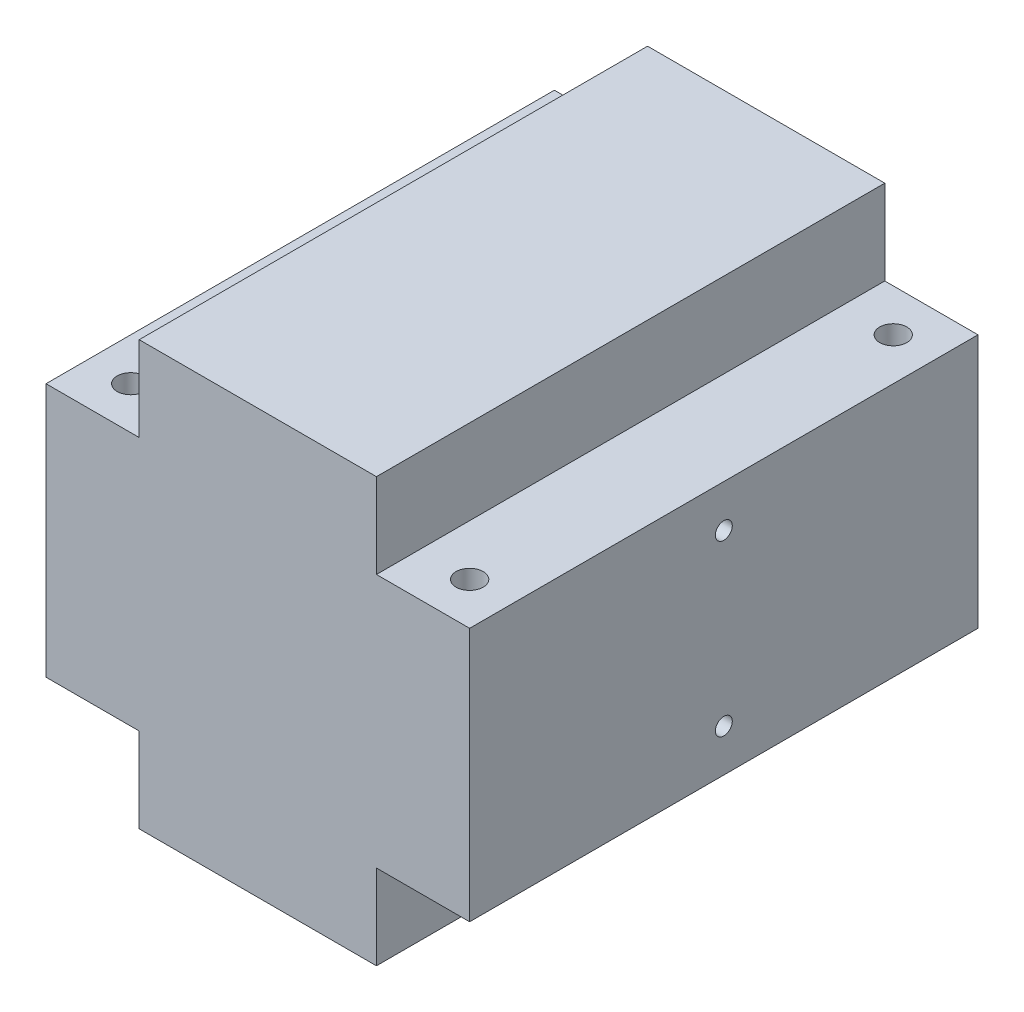
ISO-10303-21;
HEADER;
FILE_DESCRIPTION(('STEP AP214'),'2;1');
FILE_NAME('part.step','',(''),(''),'','','');
FILE_SCHEMA(('AUTOMOTIVE_DESIGN { 1 0 10303 214 1 1 1 1 }'));
ENDSEC;
DATA;
#1=APPLICATION_CONTEXT('core data for automotive mechanical design processes');
#2=APPLICATION_PROTOCOL_DEFINITION('international standard','automotive_design',2000,#1);
#3=PRODUCT_CONTEXT('',#1,'mechanical');
#4=PRODUCT('Part','Part','',(#3));
#5=PRODUCT_RELATED_PRODUCT_CATEGORY('part','',(#4));
#6=PRODUCT_DEFINITION_FORMATION('','',#4);
#7=PRODUCT_DEFINITION_CONTEXT('part definition',#1,'design');
#8=PRODUCT_DEFINITION('design','',#6,#7);
#9=PRODUCT_DEFINITION_SHAPE('','',#8);
#10=(LENGTH_UNIT() NAMED_UNIT(*) SI_UNIT(.MILLI.,.METRE.));
#11=(NAMED_UNIT(*) PLANE_ANGLE_UNIT() SI_UNIT($,.RADIAN.));
#12=(NAMED_UNIT(*) SI_UNIT($,.STERADIAN.) SOLID_ANGLE_UNIT());
#13=UNCERTAINTY_MEASURE_WITH_UNIT(LENGTH_MEASURE(1.E-05),#10,'distance_accuracy_value','');
#14=(GEOMETRIC_REPRESENTATION_CONTEXT(3) GLOBAL_UNCERTAINTY_ASSIGNED_CONTEXT((#13)) GLOBAL_UNIT_ASSIGNED_CONTEXT((#10,
#11,#12)) REPRESENTATION_CONTEXT('',''));
#15=CARTESIAN_POINT('',(0.,0.,0.));
#16=DIRECTION('',(0.,0.,1.));
#17=DIRECTION('',(1.,0.,0.));
#18=AXIS2_PLACEMENT_3D('',#15,#16,#17);
#19=CARTESIAN_POINT('',(0.,400.,600.));
#20=DIRECTION('',(0.,-1.,0.));
#21=DIRECTION('',(0.,0.,-1.));
#22=AXIS2_PLACEMENT_3D('',#19,#20,#21);
#23=PLANE('',#22);
#24=CARTESIAN_POINT('',(50.,400.,50.));
#25=DIRECTION('',(0.,-1.,0.));
#26=DIRECTION('',(0.,0.,-1.));
#27=AXIS2_PLACEMENT_3D('',#24,#25,#26);
#28=CIRCLE('',#27,16.);
#29=CARTESIAN_POINT('',(50.,400.,34.));
#30=VERTEX_POINT('',#29);
#31=EDGE_CURVE('E249',#30,#30,#28,.T.);
#32=ORIENTED_EDGE('',*,*,#31,.T.);
#33=EDGE_LOOP('',(#32));
#34=FACE_BOUND('',#33,.T.);
#35=CARTESIAN_POINT('',(50.,400.,550.));
#36=DIRECTION('',(0.,-1.,0.));
#37=DIRECTION('',(0.,0.,-1.));
#38=AXIS2_PLACEMENT_3D('',#35,#36,#37);
#39=CIRCLE('',#38,16.);
#40=CARTESIAN_POINT('',(50.,400.,534.));
#41=VERTEX_POINT('',#40);
#42=EDGE_CURVE('E255',#41,#41,#39,.T.);
#43=ORIENTED_EDGE('',*,*,#42,.T.);
#44=EDGE_LOOP('',(#43));
#45=FACE_BOUND('',#44,.T.);
#46=DIRECTION('',(-1.,0.,0.));
#47=VECTOR('',#46,1.);
#48=CARTESIAN_POINT('',(0.,400.,0.));
#49=LINE('',#48,#47);
#50=CARTESIAN_POINT('',(110.,400.,0.));
#51=VERTEX_POINT('',#50);
#52=CARTESIAN_POINT('',(0.,400.,0.));
#53=VERTEX_POINT('',#52);
#54=EDGE_CURVE('E175',#51,#53,#49,.T.);
#55=ORIENTED_EDGE('',*,*,#54,.T.);
#56=DIRECTION('',(0.,0.,-1.));
#57=VECTOR('',#56,1.);
#58=CARTESIAN_POINT('',(0.,400.,600.));
#59=LINE('',#58,#57);
#60=CARTESIAN_POINT('',(0.,400.,600.));
#61=VERTEX_POINT('',#60);
#62=EDGE_CURVE('E11',#61,#53,#59,.T.);
#63=ORIENTED_EDGE('',*,*,#62,.F.);
#64=DIRECTION('',(-1.,0.,0.));
#65=VECTOR('',#64,1.);
#66=CARTESIAN_POINT('',(0.,400.,600.));
#67=LINE('',#66,#65);
#68=CARTESIAN_POINT('',(110.,400.,600.));
#69=VERTEX_POINT('',#68);
#70=EDGE_CURVE('E198',#69,#61,#67,.T.);
#71=ORIENTED_EDGE('',*,*,#70,.F.);
#72=DIRECTION('',(0.,0.,-1.));
#73=VECTOR('',#72,1.);
#74=CARTESIAN_POINT('',(110.,400.,600.));
#75=LINE('',#74,#73);
#76=EDGE_CURVE('E171',#69,#51,#75,.T.);
#77=ORIENTED_EDGE('',*,*,#76,.T.);
#78=EDGE_LOOP('',(#55,#63,#71,#77));
#79=FACE_BOUND('',#78,.T.);
#80=ADVANCED_FACE('F53',(#34,#45,#79),#23,.F.);
#81=CARTESIAN_POINT('',(0.,100.,600.));
#82=DIRECTION('',(1.,0.,0.));
#83=DIRECTION('',(0.,0.,-1.));
#84=AXIS2_PLACEMENT_3D('',#81,#82,#83);
#85=PLANE('',#84);
#86=CARTESIAN_POINT('',(0.,150.,300.));
#87=DIRECTION('',(-1.,0.,0.));
#88=DIRECTION('',(0.,0.,1.));
#89=AXIS2_PLACEMENT_3D('',#86,#87,#88);
#90=CIRCLE('',#89,9.99999999999998);
#91=CARTESIAN_POINT('',(0.,150.,310.));
#92=VERTEX_POINT('',#91);
#93=EDGE_CURVE('E595',#92,#92,#90,.T.);
#94=ORIENTED_EDGE('',*,*,#93,.F.);
#95=EDGE_LOOP('',(#94));
#96=FACE_BOUND('',#95,.T.);
#97=CARTESIAN_POINT('',(0.,350.,300.));
#98=DIRECTION('',(-1.,0.,0.));
#99=DIRECTION('',(0.,0.,1.));
#100=AXIS2_PLACEMENT_3D('',#97,#98,#99);
#101=CIRCLE('',#100,9.99999999999998);
#102=CARTESIAN_POINT('',(0.,350.,310.));
#103=VERTEX_POINT('',#102);
#104=EDGE_CURVE('E598',#103,#103,#101,.T.);
#105=ORIENTED_EDGE('',*,*,#104,.F.);
#106=EDGE_LOOP('',(#105));
#107=FACE_BOUND('',#106,.T.);
#108=DIRECTION('',(0.,-1.,0.));
#109=VECTOR('',#108,1.);
#110=CARTESIAN_POINT('',(0.,100.,0.));
#111=LINE('',#110,#109);
#112=CARTESIAN_POINT('',(0.,100.,0.));
#113=VERTEX_POINT('',#112);
#114=EDGE_CURVE('E178',#53,#113,#111,.T.);
#115=ORIENTED_EDGE('',*,*,#114,.T.);
#116=DIRECTION('',(0.,0.,-1.));
#117=VECTOR('',#116,1.);
#118=CARTESIAN_POINT('',(0.,100.,600.));
#119=LINE('',#118,#117);
#120=CARTESIAN_POINT('',(0.,100.,600.));
#121=VERTEX_POINT('',#120);
#122=EDGE_CURVE('E62',#121,#113,#119,.T.);
#123=ORIENTED_EDGE('',*,*,#122,.F.);
#124=DIRECTION('',(0.,-1.,0.));
#125=VECTOR('',#124,1.);
#126=CARTESIAN_POINT('',(0.,100.,600.));
#127=LINE('',#126,#125);
#128=EDGE_CURVE('E126',#61,#121,#127,.T.);
#129=ORIENTED_EDGE('',*,*,#128,.F.);
#130=ORIENTED_EDGE('',*,*,#62,.T.);
#131=EDGE_LOOP('',(#115,#123,#129,#130));
#132=FACE_BOUND('',#131,.T.);
#133=ADVANCED_FACE('F303',(#96,#107,#132),#85,.F.);
#134=CARTESIAN_POINT('',(0.,100.,600.));
#135=DIRECTION('',(0.,1.,0.));
#136=DIRECTION('',(0.,0.,1.));
#137=AXIS2_PLACEMENT_3D('',#134,#135,#136);
#138=PLANE('',#137);
#139=CARTESIAN_POINT('',(50.,99.9999999999999,50.));
#140=DIRECTION('',(0.,-1.,0.));
#141=DIRECTION('',(0.,0.,-1.));
#142=AXIS2_PLACEMENT_3D('',#139,#140,#141);
#143=CIRCLE('',#142,16.);
#144=CARTESIAN_POINT('',(50.,99.9999999999999,34.));
#145=VERTEX_POINT('',#144);
#146=EDGE_CURVE('E234',#145,#145,#143,.T.);
#147=ORIENTED_EDGE('',*,*,#146,.F.);
#148=EDGE_LOOP('',(#147));
#149=FACE_BOUND('',#148,.T.);
#150=CARTESIAN_POINT('',(50.,99.9999999999999,550.));
#151=DIRECTION('',(0.,-1.,0.));
#152=DIRECTION('',(0.,0.,-1.));
#153=AXIS2_PLACEMENT_3D('',#150,#151,#152);
#154=CIRCLE('',#153,16.);
#155=CARTESIAN_POINT('',(50.,99.9999999999999,534.));
#156=VERTEX_POINT('',#155);
#157=EDGE_CURVE('E252',#156,#156,#154,.T.);
#158=ORIENTED_EDGE('',*,*,#157,.F.);
#159=EDGE_LOOP('',(#158));
#160=FACE_BOUND('',#159,.T.);
#161=DIRECTION('',(1.,0.,0.));
#162=VECTOR('',#161,1.);
#163=CARTESIAN_POINT('',(0.,100.,0.));
#164=LINE('',#163,#162);
#165=CARTESIAN_POINT('',(110.,100.,0.));
#166=VERTEX_POINT('',#165);
#167=EDGE_CURVE('E181',#113,#166,#164,.T.);
#168=ORIENTED_EDGE('',*,*,#167,.T.);
#169=DIRECTION('',(0.,0.,-1.));
#170=VECTOR('',#169,1.);
#171=CARTESIAN_POINT('',(110.,100.,600.));
#172=LINE('',#171,#170);
#173=CARTESIAN_POINT('',(110.,100.,600.));
#174=VERTEX_POINT('',#173);
#175=EDGE_CURVE('E217',#174,#166,#172,.T.);
#176=ORIENTED_EDGE('',*,*,#175,.F.);
#177=DIRECTION('',(1.,0.,0.));
#178=VECTOR('',#177,1.);
#179=CARTESIAN_POINT('',(0.,100.,600.));
#180=LINE('',#179,#178);
#181=EDGE_CURVE('E264',#121,#174,#180,.T.);
#182=ORIENTED_EDGE('',*,*,#181,.F.);
#183=ORIENTED_EDGE('',*,*,#122,.T.);
#184=EDGE_LOOP('',(#168,#176,#182,#183));
#185=FACE_BOUND('',#184,.T.);
#186=ADVANCED_FACE('F310',(#149,#160,#185),#138,.F.);
#187=CARTESIAN_POINT('',(110.,100.,600.));
#188=DIRECTION('',(1.,0.,0.));
#189=DIRECTION('',(0.,1.,0.));
#190=AXIS2_PLACEMENT_3D('',#187,#188,#189);
#191=PLANE('',#190);
#192=DIRECTION('',(0.,-1.,0.));
#193=VECTOR('',#192,1.);
#194=CARTESIAN_POINT('',(110.,100.,0.));
#195=LINE('',#194,#193);
#196=CARTESIAN_POINT('',(110.,0.,0.));
#197=VERTEX_POINT('',#196);
#198=EDGE_CURVE('E183',#166,#197,#195,.T.);
#199=ORIENTED_EDGE('',*,*,#198,.T.);
#200=DIRECTION('',(0.,0.,-1.));
#201=VECTOR('',#200,1.);
#202=CARTESIAN_POINT('',(110.,0.,600.));
#203=LINE('',#202,#201);
#204=CARTESIAN_POINT('',(110.,0.,600.));
#205=VERTEX_POINT('',#204);
#206=EDGE_CURVE('E214',#205,#197,#203,.T.);
#207=ORIENTED_EDGE('',*,*,#206,.F.);
#208=DIRECTION('',(0.,-1.,0.));
#209=VECTOR('',#208,1.);
#210=CARTESIAN_POINT('',(110.,100.,600.));
#211=LINE('',#210,#209);
#212=EDGE_CURVE('E266',#174,#205,#211,.T.);
#213=ORIENTED_EDGE('',*,*,#212,.F.);
#214=ORIENTED_EDGE('',*,*,#175,.T.);
#215=EDGE_LOOP('',(#199,#207,#213,#214));
#216=FACE_BOUND('',#215,.T.);
#217=ADVANCED_FACE('F416',(#216),#191,.F.);
#218=CARTESIAN_POINT('',(110.,0.,600.));
#219=DIRECTION('',(0.,1.,0.));
#220=DIRECTION('',(0.,0.,1.));
#221=AXIS2_PLACEMENT_3D('',#218,#219,#220);
#222=PLANE('',#221);
#223=DIRECTION('',(1.,0.,0.));
#224=VECTOR('',#223,1.);
#225=CARTESIAN_POINT('',(110.,0.,0.));
#226=LINE('',#225,#224);
#227=CARTESIAN_POINT('',(390.,0.,0.));
#228=VERTEX_POINT('',#227);
#229=EDGE_CURVE('E185',#197,#228,#226,.T.);
#230=ORIENTED_EDGE('',*,*,#229,.T.);
#231=DIRECTION('',(0.,0.,-1.));
#232=VECTOR('',#231,1.);
#233=CARTESIAN_POINT('',(390.,0.,600.));
#234=LINE('',#233,#232);
#235=CARTESIAN_POINT('',(390.,0.,600.));
#236=VERTEX_POINT('',#235);
#237=EDGE_CURVE('E211',#236,#228,#234,.T.);
#238=ORIENTED_EDGE('',*,*,#237,.F.);
#239=DIRECTION('',(1.,0.,0.));
#240=VECTOR('',#239,1.);
#241=CARTESIAN_POINT('',(110.,0.,600.));
#242=LINE('',#241,#240);
#243=EDGE_CURVE('E268',#205,#236,#242,.T.);
#244=ORIENTED_EDGE('',*,*,#243,.F.);
#245=ORIENTED_EDGE('',*,*,#206,.T.);
#246=EDGE_LOOP('',(#230,#238,#244,#245));
#247=FACE_BOUND('',#246,.T.);
#248=ADVANCED_FACE('F406',(#247),#222,.F.);
#249=CARTESIAN_POINT('',(390.,100.,600.));
#250=DIRECTION('',(-1.,0.,0.));
#251=DIRECTION('',(0.,0.,1.));
#252=AXIS2_PLACEMENT_3D('',#249,#250,#251);
#253=PLANE('',#252);
#254=DIRECTION('',(0.,1.,0.));
#255=VECTOR('',#254,1.);
#256=CARTESIAN_POINT('',(390.,100.,0.));
#257=LINE('',#256,#255);
#258=CARTESIAN_POINT('',(390.,100.,0.));
#259=VERTEX_POINT('',#258);
#260=EDGE_CURVE('E187',#228,#259,#257,.T.);
#261=ORIENTED_EDGE('',*,*,#260,.T.);
#262=DIRECTION('',(0.,0.,-1.));
#263=VECTOR('',#262,1.);
#264=CARTESIAN_POINT('',(390.,100.,600.));
#265=LINE('',#264,#263);
#266=CARTESIAN_POINT('',(390.,100.,600.));
#267=VERTEX_POINT('',#266);
#268=EDGE_CURVE('E208',#267,#259,#265,.T.);
#269=ORIENTED_EDGE('',*,*,#268,.F.);
#270=DIRECTION('',(0.,1.,0.));
#271=VECTOR('',#270,1.);
#272=CARTESIAN_POINT('',(390.,100.,600.));
#273=LINE('',#272,#271);
#274=EDGE_CURVE('E270',#236,#267,#273,.T.);
#275=ORIENTED_EDGE('',*,*,#274,.F.);
#276=ORIENTED_EDGE('',*,*,#237,.T.);
#277=EDGE_LOOP('',(#261,#269,#275,#276));
#278=FACE_BOUND('',#277,.T.);
#279=ADVANCED_FACE('F396',(#278),#253,.F.);
#280=CARTESIAN_POINT('',(500.,100.,600.));
#281=DIRECTION('',(0.,1.,0.));
#282=DIRECTION('',(-1.,0.,0.));
#283=AXIS2_PLACEMENT_3D('',#280,#281,#282);
#284=PLANE('',#283);
#285=CARTESIAN_POINT('',(450.,100.,50.));
#286=DIRECTION('',(0.,-1.,0.));
#287=DIRECTION('',(0.,0.,-1.));
#288=AXIS2_PLACEMENT_3D('',#285,#286,#287);
#289=CIRCLE('',#288,16.);
#290=CARTESIAN_POINT('',(450.,100.,34.));
#291=VERTEX_POINT('',#290);
#292=EDGE_CURVE('E227',#291,#291,#289,.T.);
#293=ORIENTED_EDGE('',*,*,#292,.F.);
#294=EDGE_LOOP('',(#293));
#295=FACE_BOUND('',#294,.T.);
#296=CARTESIAN_POINT('',(450.,100.,550.));
#297=DIRECTION('',(0.,-1.,0.));
#298=DIRECTION('',(0.,0.,-1.));
#299=AXIS2_PLACEMENT_3D('',#296,#297,#298);
#300=CIRCLE('',#299,16.);
#301=CARTESIAN_POINT('',(450.,100.,534.));
#302=VERTEX_POINT('',#301);
#303=EDGE_CURVE('E224',#302,#302,#300,.T.);
#304=ORIENTED_EDGE('',*,*,#303,.F.);
#305=EDGE_LOOP('',(#304));
#306=FACE_BOUND('',#305,.T.);
#307=DIRECTION('',(1.,0.,0.));
#308=VECTOR('',#307,1.);
#309=CARTESIAN_POINT('',(500.,100.,0.));
#310=LINE('',#309,#308);
#311=CARTESIAN_POINT('',(500.,100.,0.));
#312=VERTEX_POINT('',#311);
#313=EDGE_CURVE('E189',#259,#312,#310,.T.);
#314=ORIENTED_EDGE('',*,*,#313,.T.);
#315=DIRECTION('',(0.,0.,-1.));
#316=VECTOR('',#315,1.);
#317=CARTESIAN_POINT('',(500.,100.,600.));
#318=LINE('',#317,#316);
#319=CARTESIAN_POINT('',(500.,100.,600.));
#320=VERTEX_POINT('',#319);
#321=EDGE_CURVE('E205',#320,#312,#318,.T.);
#322=ORIENTED_EDGE('',*,*,#321,.F.);
#323=DIRECTION('',(1.,0.,0.));
#324=VECTOR('',#323,1.);
#325=CARTESIAN_POINT('',(500.,100.,600.));
#326=LINE('',#325,#324);
#327=EDGE_CURVE('E272',#267,#320,#326,.T.);
#328=ORIENTED_EDGE('',*,*,#327,.F.);
#329=ORIENTED_EDGE('',*,*,#268,.T.);
#330=EDGE_LOOP('',(#314,#322,#328,#329));
#331=FACE_BOUND('',#330,.T.);
#332=ADVANCED_FACE('F384',(#295,#306,#331),#284,.F.);
#333=CARTESIAN_POINT('',(500.,100.,600.));
#334=DIRECTION('',(-1.,0.,0.));
#335=DIRECTION('',(0.,0.,1.));
#336=AXIS2_PLACEMENT_3D('',#333,#334,#335);
#337=PLANE('',#336);
#338=CARTESIAN_POINT('',(500.,150.,300.));
#339=DIRECTION('',(-1.,0.,0.));
#340=DIRECTION('',(0.,0.,1.));
#341=AXIS2_PLACEMENT_3D('',#338,#339,#340);
#342=CIRCLE('',#341,9.99999999999998);
#343=CARTESIAN_POINT('',(500.,150.,310.));
#344=VERTEX_POINT('',#343);
#345=EDGE_CURVE('E56',#344,#344,#342,.F.);
#346=ORIENTED_EDGE('',*,*,#345,.F.);
#347=EDGE_LOOP('',(#346));
#348=FACE_BOUND('',#347,.T.);
#349=CARTESIAN_POINT('',(500.,350.,300.));
#350=DIRECTION('',(-1.,0.,0.));
#351=DIRECTION('',(0.,0.,1.));
#352=AXIS2_PLACEMENT_3D('',#349,#350,#351);
#353=CIRCLE('',#352,9.99999999999998);
#354=CARTESIAN_POINT('',(500.,350.,310.));
#355=VERTEX_POINT('',#354);
#356=EDGE_CURVE('E228',#355,#355,#353,.F.);
#357=ORIENTED_EDGE('',*,*,#356,.F.);
#358=EDGE_LOOP('',(#357));
#359=FACE_BOUND('',#358,.T.);
#360=DIRECTION('',(0.,1.,0.));
#361=VECTOR('',#360,1.);
#362=CARTESIAN_POINT('',(500.,100.,0.));
#363=LINE('',#362,#361);
#364=CARTESIAN_POINT('',(500.,400.,0.));
#365=VERTEX_POINT('',#364);
#366=EDGE_CURVE('E191',#312,#365,#363,.T.);
#367=ORIENTED_EDGE('',*,*,#366,.T.);
#368=DIRECTION('',(0.,0.,-1.));
#369=VECTOR('',#368,1.);
#370=CARTESIAN_POINT('',(500.,400.,600.));
#371=LINE('',#370,#369);
#372=CARTESIAN_POINT('',(500.,400.,600.));
#373=VERTEX_POINT('',#372);
#374=EDGE_CURVE('E202',#373,#365,#371,.T.);
#375=ORIENTED_EDGE('',*,*,#374,.F.);
#376=DIRECTION('',(0.,1.,0.));
#377=VECTOR('',#376,1.);
#378=CARTESIAN_POINT('',(500.,100.,600.));
#379=LINE('',#378,#377);
#380=EDGE_CURVE('E274',#320,#373,#379,.T.);
#381=ORIENTED_EDGE('',*,*,#380,.F.);
#382=ORIENTED_EDGE('',*,*,#321,.T.);
#383=EDGE_LOOP('',(#367,#375,#381,#382));
#384=FACE_BOUND('',#383,.T.);
#385=ADVANCED_FACE('F280',(#348,#359,#384),#337,.F.);
#386=CARTESIAN_POINT('',(390.,400.,600.));
#387=DIRECTION('',(0.,-1.,0.));
#388=DIRECTION('',(0.,0.,-1.));
#389=AXIS2_PLACEMENT_3D('',#386,#387,#388);
#390=PLANE('',#389);
#391=CARTESIAN_POINT('',(450.,400.,50.));
#392=DIRECTION('',(0.,-1.,0.));
#393=DIRECTION('',(0.,0.,-1.));
#394=AXIS2_PLACEMENT_3D('',#391,#392,#393);
#395=CIRCLE('',#394,16.);
#396=CARTESIAN_POINT('',(450.,400.,34.));
#397=VERTEX_POINT('',#396);
#398=EDGE_CURVE('E225',#397,#397,#395,.T.);
#399=ORIENTED_EDGE('',*,*,#398,.T.);
#400=EDGE_LOOP('',(#399));
#401=FACE_BOUND('',#400,.T.);
#402=CARTESIAN_POINT('',(450.,400.,550.));
#403=DIRECTION('',(0.,-1.,0.));
#404=DIRECTION('',(0.,0.,-1.));
#405=AXIS2_PLACEMENT_3D('',#402,#403,#404);
#406=CIRCLE('',#405,16.);
#407=CARTESIAN_POINT('',(450.,400.,534.));
#408=VERTEX_POINT('',#407);
#409=EDGE_CURVE('E179',#408,#408,#406,.T.);
#410=ORIENTED_EDGE('',*,*,#409,.T.);
#411=EDGE_LOOP('',(#410));
#412=FACE_BOUND('',#411,.T.);
#413=DIRECTION('',(-1.,0.,0.));
#414=VECTOR('',#413,1.);
#415=CARTESIAN_POINT('',(390.,400.,0.));
#416=LINE('',#415,#414);
#417=CARTESIAN_POINT('',(390.,400.,0.));
#418=VERTEX_POINT('',#417);
#419=EDGE_CURVE('E193',#365,#418,#416,.T.);
#420=ORIENTED_EDGE('',*,*,#419,.T.);
#421=DIRECTION('',(0.,0.,-1.));
#422=VECTOR('',#421,1.);
#423=CARTESIAN_POINT('',(390.,400.,600.));
#424=LINE('',#423,#422);
#425=CARTESIAN_POINT('',(390.,400.,600.));
#426=VERTEX_POINT('',#425);
#427=EDGE_CURVE('E166',#426,#418,#424,.T.);
#428=ORIENTED_EDGE('',*,*,#427,.F.);
#429=DIRECTION('',(-1.,0.,0.));
#430=VECTOR('',#429,1.);
#431=CARTESIAN_POINT('',(390.,400.,600.));
#432=LINE('',#431,#430);
#433=EDGE_CURVE('E157',#373,#426,#432,.T.);
#434=ORIENTED_EDGE('',*,*,#433,.F.);
#435=ORIENTED_EDGE('',*,*,#374,.T.);
#436=EDGE_LOOP('',(#420,#428,#434,#435));
#437=FACE_BOUND('',#436,.T.);
#438=ADVANCED_FACE('F284',(#401,#412,#437),#390,.F.);
#439=CARTESIAN_POINT('',(390.,500.,600.));
#440=DIRECTION('',(-1.,0.,0.));
#441=DIRECTION('',(0.,0.,1.));
#442=AXIS2_PLACEMENT_3D('',#439,#440,#441);
#443=PLANE('',#442);
#444=DIRECTION('',(0.,1.,0.));
#445=VECTOR('',#444,1.);
#446=CARTESIAN_POINT('',(390.,500.,0.));
#447=LINE('',#446,#445);
#448=CARTESIAN_POINT('',(390.,500.,0.));
#449=VERTEX_POINT('',#448);
#450=EDGE_CURVE('E165',#418,#449,#447,.T.);
#451=ORIENTED_EDGE('',*,*,#450,.T.);
#452=DIRECTION('',(0.,0.,-1.));
#453=VECTOR('',#452,1.);
#454=CARTESIAN_POINT('',(390.,500.,600.));
#455=LINE('',#454,#453);
#456=CARTESIAN_POINT('',(390.,500.,600.));
#457=VERTEX_POINT('',#456);
#458=EDGE_CURVE('E162',#457,#449,#455,.T.);
#459=ORIENTED_EDGE('',*,*,#458,.F.);
#460=DIRECTION('',(0.,1.,0.));
#461=VECTOR('',#460,1.);
#462=CARTESIAN_POINT('',(390.,500.,600.));
#463=LINE('',#462,#461);
#464=EDGE_CURVE('E151',#426,#457,#463,.T.);
#465=ORIENTED_EDGE('',*,*,#464,.F.);
#466=ORIENTED_EDGE('',*,*,#427,.T.);
#467=EDGE_LOOP('',(#451,#459,#465,#466));
#468=FACE_BOUND('',#467,.T.);
#469=ADVANCED_FACE('F163',(#468),#443,.F.);
#470=CARTESIAN_POINT('',(110.,500.,600.));
#471=DIRECTION('',(0.,-1.,0.));
#472=DIRECTION('',(0.,0.,-1.));
#473=AXIS2_PLACEMENT_3D('',#470,#471,#472);
#474=PLANE('',#473);
#475=DIRECTION('',(-1.,0.,0.));
#476=VECTOR('',#475,1.);
#477=CARTESIAN_POINT('',(110.,500.,0.));
#478=LINE('',#477,#476);
#479=CARTESIAN_POINT('',(110.,500.,0.));
#480=VERTEX_POINT('',#479);
#481=EDGE_CURVE('E112',#449,#480,#478,.T.);
#482=ORIENTED_EDGE('',*,*,#481,.T.);
#483=DIRECTION('',(0.,0.,-1.));
#484=VECTOR('',#483,1.);
#485=CARTESIAN_POINT('',(110.,500.,600.));
#486=LINE('',#485,#484);
#487=CARTESIAN_POINT('',(110.,500.,600.));
#488=VERTEX_POINT('',#487);
#489=EDGE_CURVE('E167',#488,#480,#486,.T.);
#490=ORIENTED_EDGE('',*,*,#489,.F.);
#491=DIRECTION('',(-1.,0.,0.));
#492=VECTOR('',#491,1.);
#493=CARTESIAN_POINT('',(110.,500.,600.));
#494=LINE('',#493,#492);
#495=EDGE_CURVE('E155',#457,#488,#494,.T.);
#496=ORIENTED_EDGE('',*,*,#495,.F.);
#497=ORIENTED_EDGE('',*,*,#458,.T.);
#498=EDGE_LOOP('',(#482,#490,#496,#497));
#499=FACE_BOUND('',#498,.T.);
#500=ADVANCED_FACE('F169',(#499),#474,.F.);
#501=CARTESIAN_POINT('',(110.,500.,600.));
#502=DIRECTION('',(1.,0.,0.));
#503=DIRECTION('',(0.,1.,0.));
#504=AXIS2_PLACEMENT_3D('',#501,#502,#503);
#505=PLANE('',#504);
#506=DIRECTION('',(0.,-1.,0.));
#507=VECTOR('',#506,1.);
#508=CARTESIAN_POINT('',(110.,500.,0.));
#509=LINE('',#508,#507);
#510=EDGE_CURVE('E118',#480,#51,#509,.T.);
#511=ORIENTED_EDGE('',*,*,#510,.T.);
#512=ORIENTED_EDGE('',*,*,#76,.F.);
#513=DIRECTION('',(0.,-1.,0.));
#514=VECTOR('',#513,1.);
#515=CARTESIAN_POINT('',(110.,500.,600.));
#516=LINE('',#515,#514);
#517=EDGE_CURVE('E71',#488,#69,#516,.T.);
#518=ORIENTED_EDGE('',*,*,#517,.F.);
#519=ORIENTED_EDGE('',*,*,#489,.T.);
#520=EDGE_LOOP('',(#511,#512,#518,#519));
#521=FACE_BOUND('',#520,.T.);
#522=ADVANCED_FACE('F292',(#521),#505,.F.);
#523=CARTESIAN_POINT('',(0.,0.,600.));
#524=DIRECTION('',(0.,0.,-1.));
#525=DIRECTION('',(-1.,0.,0.));
#526=AXIS2_PLACEMENT_3D('',#523,#524,#525);
#527=PLANE('',#526);
#528=ORIENTED_EDGE('',*,*,#70,.T.);
#529=ORIENTED_EDGE('',*,*,#128,.T.);
#530=ORIENTED_EDGE('',*,*,#181,.T.);
#531=ORIENTED_EDGE('',*,*,#212,.T.);
#532=ORIENTED_EDGE('',*,*,#243,.T.);
#533=ORIENTED_EDGE('',*,*,#274,.T.);
#534=ORIENTED_EDGE('',*,*,#327,.T.);
#535=ORIENTED_EDGE('',*,*,#380,.T.);
#536=ORIENTED_EDGE('',*,*,#433,.T.);
#537=ORIENTED_EDGE('',*,*,#464,.T.);
#538=ORIENTED_EDGE('',*,*,#495,.T.);
#539=ORIENTED_EDGE('',*,*,#517,.T.);
#540=EDGE_LOOP('',(#528,#529,#530,#531,#532,#533,#534,#535,#536,#537,#538,#539));
#541=FACE_BOUND('',#540,.T.);
#542=ADVANCED_FACE('F153',(#541),#527,.F.);
#543=CARTESIAN_POINT('',(0.,0.,0.));
#544=DIRECTION('',(0.,0.,-1.));
#545=DIRECTION('',(-1.,0.,0.));
#546=AXIS2_PLACEMENT_3D('',#543,#544,#545);
#547=PLANE('',#546);
#548=ORIENTED_EDGE('',*,*,#54,.F.);
#549=ORIENTED_EDGE('',*,*,#510,.F.);
#550=ORIENTED_EDGE('',*,*,#481,.F.);
#551=ORIENTED_EDGE('',*,*,#450,.F.);
#552=ORIENTED_EDGE('',*,*,#419,.F.);
#553=ORIENTED_EDGE('',*,*,#366,.F.);
#554=ORIENTED_EDGE('',*,*,#313,.F.);
#555=ORIENTED_EDGE('',*,*,#260,.F.);
#556=ORIENTED_EDGE('',*,*,#229,.F.);
#557=ORIENTED_EDGE('',*,*,#198,.F.);
#558=ORIENTED_EDGE('',*,*,#167,.F.);
#559=ORIENTED_EDGE('',*,*,#114,.F.);
#560=EDGE_LOOP('',(#548,#549,#550,#551,#552,#553,#554,#555,#556,#557,#558,#559));
#561=FACE_BOUND('',#560,.T.);
#562=ADVANCED_FACE('F287',(#561),#547,.T.);
#563=CARTESIAN_POINT('',(450.,100.,550.));
#564=DIRECTION('',(0.,-1.,0.));
#565=DIRECTION('',(0.,0.,-1.));
#566=AXIS2_PLACEMENT_3D('',#563,#564,#565);
#567=CYLINDRICAL_SURFACE('',#566,16.);
#568=ORIENTED_EDGE('',*,*,#303,.T.);
#569=EDGE_LOOP('',(#568));
#570=FACE_BOUND('',#569,.T.);
#571=ORIENTED_EDGE('',*,*,#409,.F.);
#572=EDGE_LOOP('',(#571));
#573=FACE_BOUND('',#572,.T.);
#574=ADVANCED_FACE('F329',(#570,#573),#567,.F.);
#575=CARTESIAN_POINT('',(450.,100.,50.));
#576=DIRECTION('',(0.,-1.,0.));
#577=DIRECTION('',(0.,0.,-1.));
#578=AXIS2_PLACEMENT_3D('',#575,#576,#577);
#579=CYLINDRICAL_SURFACE('',#578,16.);
#580=ORIENTED_EDGE('',*,*,#292,.T.);
#581=EDGE_LOOP('',(#580));
#582=FACE_BOUND('',#581,.T.);
#583=ORIENTED_EDGE('',*,*,#398,.F.);
#584=EDGE_LOOP('',(#583));
#585=FACE_BOUND('',#584,.T.);
#586=ADVANCED_FACE('F319',(#582,#585),#579,.F.);
#587=CARTESIAN_POINT('',(50.,99.9999999999999,550.));
#588=DIRECTION('',(0.,-1.,0.));
#589=DIRECTION('',(0.,0.,-1.));
#590=AXIS2_PLACEMENT_3D('',#587,#588,#589);
#591=CYLINDRICAL_SURFACE('',#590,16.);
#592=ORIENTED_EDGE('',*,*,#157,.T.);
#593=EDGE_LOOP('',(#592));
#594=FACE_BOUND('',#593,.T.);
#595=ORIENTED_EDGE('',*,*,#42,.F.);
#596=EDGE_LOOP('',(#595));
#597=FACE_BOUND('',#596,.T.);
#598=ADVANCED_FACE('F316',(#594,#597),#591,.F.);
#599=CARTESIAN_POINT('',(50.,99.9999999999999,50.));
#600=DIRECTION('',(0.,-1.,0.));
#601=DIRECTION('',(0.,0.,-1.));
#602=AXIS2_PLACEMENT_3D('',#599,#600,#601);
#603=CYLINDRICAL_SURFACE('',#602,16.);
#604=ORIENTED_EDGE('',*,*,#146,.T.);
#605=EDGE_LOOP('',(#604));
#606=FACE_BOUND('',#605,.T.);
#607=ORIENTED_EDGE('',*,*,#31,.F.);
#608=EDGE_LOOP('',(#607));
#609=FACE_BOUND('',#608,.T.);
#610=ADVANCED_FACE('F318',(#606,#609),#603,.F.);
#611=CARTESIAN_POINT('',(500.000012,350.,300.));
#612=DIRECTION('',(-1.,0.,0.));
#613=DIRECTION('',(0.,0.,1.));
#614=AXIS2_PLACEMENT_3D('',#611,#612,#613);
#615=CYLINDRICAL_SURFACE('',#614,9.99999999999998);
#616=CARTESIAN_POINT('',(400.,350.,300.));
#617=DIRECTION('',(1.,0.,0.));
#618=DIRECTION('',(0.,0.,-1.));
#619=AXIS2_PLACEMENT_3D('',#616,#617,#618);
#620=CIRCLE('',#619,9.99999999999998);
#621=CARTESIAN_POINT('',(400.,350.,310.));
#622=VERTEX_POINT('',#621);
#623=EDGE_CURVE('E236',#622,#622,#620,.T.);
#624=CARTESIAN_POINT('',(400.,350.,310.));
#625=CARTESIAN_POINT('',(401.041666666667,350.,310.));
#626=CARTESIAN_POINT('',(402.083333333333,350.,310.));
#627=CARTESIAN_POINT('',(404.166666666667,350.,310.));
#628=CARTESIAN_POINT('',(405.208333333333,350.,310.));
#629=CARTESIAN_POINT('',(407.291666666667,350.,310.));
#630=CARTESIAN_POINT('',(408.333333333333,350.,310.));
#631=CARTESIAN_POINT('',(410.416666666667,350.,310.));
#632=CARTESIAN_POINT('',(411.458333333333,350.,310.));
#633=CARTESIAN_POINT('',(413.541666666667,350.,310.));
#634=CARTESIAN_POINT('',(414.583333333333,350.,310.));
#635=CARTESIAN_POINT('',(416.666666666667,350.,310.));
#636=CARTESIAN_POINT('',(417.708333333333,350.,310.));
#637=CARTESIAN_POINT('',(419.791666666667,350.,310.));
#638=CARTESIAN_POINT('',(420.833333333333,350.,310.));
#639=CARTESIAN_POINT('',(422.916666666667,350.,310.));
#640=CARTESIAN_POINT('',(423.958333333333,350.,310.));
#641=CARTESIAN_POINT('',(426.041666666667,350.,310.));
#642=CARTESIAN_POINT('',(427.083333333333,350.,310.));
#643=CARTESIAN_POINT('',(429.166666666667,350.,310.));
#644=CARTESIAN_POINT('',(430.208333333333,350.,310.));
#645=CARTESIAN_POINT('',(432.291666666667,350.,310.));
#646=CARTESIAN_POINT('',(433.333333333333,350.,310.));
#647=CARTESIAN_POINT('',(435.416666666667,350.,310.));
#648=CARTESIAN_POINT('',(436.458333333333,350.,310.));
#649=CARTESIAN_POINT('',(438.541666666667,350.,310.));
#650=CARTESIAN_POINT('',(439.583333333333,350.,310.));
#651=CARTESIAN_POINT('',(441.666666666667,350.,310.));
#652=CARTESIAN_POINT('',(442.708333333333,350.,310.));
#653=CARTESIAN_POINT('',(444.791666666667,350.,310.));
#654=CARTESIAN_POINT('',(445.833333333333,350.,310.));
#655=CARTESIAN_POINT('',(447.916666666667,350.,310.));
#656=CARTESIAN_POINT('',(448.958333333333,350.,310.));
#657=CARTESIAN_POINT('',(451.041666666667,350.,310.));
#658=CARTESIAN_POINT('',(452.083333333333,350.,310.));
#659=CARTESIAN_POINT('',(454.166666666667,350.,310.));
#660=CARTESIAN_POINT('',(455.208333333333,350.,310.));
#661=CARTESIAN_POINT('',(457.291666666667,350.,310.));
#662=CARTESIAN_POINT('',(458.333333333333,350.,310.));
#663=CARTESIAN_POINT('',(460.416666666667,350.,310.));
#664=CARTESIAN_POINT('',(461.458333333333,350.,310.));
#665=CARTESIAN_POINT('',(463.541666666667,350.,310.));
#666=CARTESIAN_POINT('',(464.583333333333,350.,310.));
#667=CARTESIAN_POINT('',(466.666666666667,350.,310.));
#668=CARTESIAN_POINT('',(467.708333333333,350.,310.));
#669=CARTESIAN_POINT('',(469.791666666667,350.,310.));
#670=CARTESIAN_POINT('',(470.833333333333,350.,310.));
#671=CARTESIAN_POINT('',(472.916666666667,350.,310.));
#672=CARTESIAN_POINT('',(473.958333333333,350.,310.));
#673=CARTESIAN_POINT('',(476.041666666667,350.,310.));
#674=CARTESIAN_POINT('',(477.083333333333,350.,310.));
#675=CARTESIAN_POINT('',(479.166666666667,350.,310.));
#676=CARTESIAN_POINT('',(480.208333333333,350.,310.));
#677=CARTESIAN_POINT('',(482.291666666667,350.,310.));
#678=CARTESIAN_POINT('',(483.333333333333,350.,310.));
#679=CARTESIAN_POINT('',(485.416666666667,350.,310.));
#680=CARTESIAN_POINT('',(486.458333333333,350.,310.));
#681=CARTESIAN_POINT('',(488.541666666667,350.,310.));
#682=CARTESIAN_POINT('',(489.583333333333,350.,310.));
#683=CARTESIAN_POINT('',(491.666666666667,350.,310.));
#684=CARTESIAN_POINT('',(492.708333333333,350.,310.));
#685=CARTESIAN_POINT('',(494.791666666667,350.,310.));
#686=CARTESIAN_POINT('',(495.833333333333,350.,310.));
#687=CARTESIAN_POINT('',(497.916666666667,350.,310.));
#688=CARTESIAN_POINT('',(498.958333333333,350.,310.));
#689=CARTESIAN_POINT('',(500.,350.,310.));
#690=B_SPLINE_CURVE_WITH_KNOTS('',3,(#624,#625,#626,#627,#628,#629,#630,#631,#632,#633,#634,
#635,#636,#637,#638,#639,#640,#641,#642,#643,#644,#645,#646,#647,#648,#649,#650,#651,#652,#653,
#654,#655,#656,#657,#658,#659,#660,#661,#662,#663,#664,#665,#666,#667,#668,#669,#670,#671,#672,
#673,#674,#675,#676,#677,#678,#679,#680,#681,#682,#683,#684,#685,#686,#687,#688,#689),
.UNSPECIFIED.,.F.,.F.,(4,2,2,2,2,2,2,2,2,2,2,2,2,2,2,2,2,2,2,2,2,2,2,2,2,2,2,2,2,2,2,2,4),(0.,
3.12499999999999,6.25000000000003,9.37500000000002,12.5,15.6250000000001,18.75,21.875,25.,
28.125,31.2500000000001,34.375,37.5,40.625,43.7500000000001,46.8750000000001,50.,53.125,
56.2500000000001,59.3750000000001,62.5000000000001,65.625,68.7500000000001,71.8750000000001,
75.0000000000001,78.1250000000001,81.2500000000001,84.3750000000001,87.5000000000001,
90.6250000000001,93.7500000000001,96.8750000000001,100.),.UNSPECIFIED.);
#691=EDGE_CURVE('BSEAM326',#622,#355,#690,.T.);
#692=ORIENTED_EDGE('',*,*,#623,.F.);
#693=ORIENTED_EDGE('',*,*,#356,.T.);
#694=ORIENTED_EDGE('',*,*,#691,.T.);
#695=ORIENTED_EDGE('',*,*,#691,.F.);
#696=EDGE_LOOP('',(#692,#694,#693,#695));
#697=FACE_BOUND('',#696,.T.);
#698=ADVANCED_FACE('F326',(#697),#615,.F.);
#699=CARTESIAN_POINT('',(400.,350.,300.));
#700=DIRECTION('',(1.,0.,0.));
#701=DIRECTION('',(0.,0.,-1.));
#702=AXIS2_PLACEMENT_3D('',#699,#700,#701);
#703=PLANE('',#702);
#704=ORIENTED_EDGE('',*,*,#623,.T.);
#705=EDGE_LOOP('',(#704));
#706=FACE_BOUND('',#705,.T.);
#707=ADVANCED_FACE('F504',(#706),#703,.T.);
#708=CARTESIAN_POINT('',(500.000012,150.,300.));
#709=DIRECTION('',(-1.,0.,0.));
#710=DIRECTION('',(0.,0.,1.));
#711=AXIS2_PLACEMENT_3D('',#708,#709,#710);
#712=CYLINDRICAL_SURFACE('',#711,9.99999999999998);
#713=CARTESIAN_POINT('',(400.,150.,300.));
#714=DIRECTION('',(1.,0.,0.));
#715=DIRECTION('',(0.,0.,-1.));
#716=AXIS2_PLACEMENT_3D('',#713,#714,#715);
#717=CIRCLE('',#716,9.99999999999998);
#718=CARTESIAN_POINT('',(400.,150.,310.));
#719=VERTEX_POINT('',#718);
#720=EDGE_CURVE('E230',#719,#719,#717,.T.);
#721=CARTESIAN_POINT('',(400.,150.,310.));
#722=CARTESIAN_POINT('',(401.041666666667,150.,310.));
#723=CARTESIAN_POINT('',(402.083333333333,150.,310.));
#724=CARTESIAN_POINT('',(404.166666666667,150.,310.));
#725=CARTESIAN_POINT('',(405.208333333333,150.,310.));
#726=CARTESIAN_POINT('',(407.291666666667,150.,310.));
#727=CARTESIAN_POINT('',(408.333333333333,150.,310.));
#728=CARTESIAN_POINT('',(410.416666666667,150.,310.));
#729=CARTESIAN_POINT('',(411.458333333333,150.,310.));
#730=CARTESIAN_POINT('',(413.541666666667,150.,310.));
#731=CARTESIAN_POINT('',(414.583333333333,150.,310.));
#732=CARTESIAN_POINT('',(416.666666666667,150.,310.));
#733=CARTESIAN_POINT('',(417.708333333333,150.,310.));
#734=CARTESIAN_POINT('',(419.791666666667,150.,310.));
#735=CARTESIAN_POINT('',(420.833333333333,150.,310.));
#736=CARTESIAN_POINT('',(422.916666666667,150.,310.));
#737=CARTESIAN_POINT('',(423.958333333333,150.,310.));
#738=CARTESIAN_POINT('',(426.041666666667,150.,310.));
#739=CARTESIAN_POINT('',(427.083333333333,150.,310.));
#740=CARTESIAN_POINT('',(429.166666666667,150.,310.));
#741=CARTESIAN_POINT('',(430.208333333333,150.,310.));
#742=CARTESIAN_POINT('',(432.291666666667,150.,310.));
#743=CARTESIAN_POINT('',(433.333333333333,150.,310.));
#744=CARTESIAN_POINT('',(435.416666666667,150.,310.));
#745=CARTESIAN_POINT('',(436.458333333333,150.,310.));
#746=CARTESIAN_POINT('',(438.541666666667,150.,310.));
#747=CARTESIAN_POINT('',(439.583333333333,150.,310.));
#748=CARTESIAN_POINT('',(441.666666666667,150.,310.));
#749=CARTESIAN_POINT('',(442.708333333333,150.,310.));
#750=CARTESIAN_POINT('',(444.791666666667,150.,310.));
#751=CARTESIAN_POINT('',(445.833333333333,150.,310.));
#752=CARTESIAN_POINT('',(447.916666666667,150.,310.));
#753=CARTESIAN_POINT('',(448.958333333333,150.,310.));
#754=CARTESIAN_POINT('',(451.041666666667,150.,310.));
#755=CARTESIAN_POINT('',(452.083333333333,150.,310.));
#756=CARTESIAN_POINT('',(454.166666666667,150.,310.));
#757=CARTESIAN_POINT('',(455.208333333333,150.,310.));
#758=CARTESIAN_POINT('',(457.291666666667,150.,310.));
#759=CARTESIAN_POINT('',(458.333333333333,150.,310.));
#760=CARTESIAN_POINT('',(460.416666666667,150.,310.));
#761=CARTESIAN_POINT('',(461.458333333333,150.,310.));
#762=CARTESIAN_POINT('',(463.541666666667,150.,310.));
#763=CARTESIAN_POINT('',(464.583333333333,150.,310.));
#764=CARTESIAN_POINT('',(466.666666666667,150.,310.));
#765=CARTESIAN_POINT('',(467.708333333333,150.,310.));
#766=CARTESIAN_POINT('',(469.791666666667,150.,310.));
#767=CARTESIAN_POINT('',(470.833333333333,150.,310.));
#768=CARTESIAN_POINT('',(472.916666666667,150.,310.));
#769=CARTESIAN_POINT('',(473.958333333333,150.,310.));
#770=CARTESIAN_POINT('',(476.041666666667,150.,310.));
#771=CARTESIAN_POINT('',(477.083333333333,150.,310.));
#772=CARTESIAN_POINT('',(479.166666666667,150.,310.));
#773=CARTESIAN_POINT('',(480.208333333333,150.,310.));
#774=CARTESIAN_POINT('',(482.291666666667,150.,310.));
#775=CARTESIAN_POINT('',(483.333333333333,150.,310.));
#776=CARTESIAN_POINT('',(485.416666666667,150.,310.));
#777=CARTESIAN_POINT('',(486.458333333333,150.,310.));
#778=CARTESIAN_POINT('',(488.541666666667,150.,310.));
#779=CARTESIAN_POINT('',(489.583333333333,150.,310.));
#780=CARTESIAN_POINT('',(491.666666666667,150.,310.));
#781=CARTESIAN_POINT('',(492.708333333333,150.,310.));
#782=CARTESIAN_POINT('',(494.791666666667,150.,310.));
#783=CARTESIAN_POINT('',(495.833333333333,150.,310.));
#784=CARTESIAN_POINT('',(497.916666666667,150.,310.));
#785=CARTESIAN_POINT('',(498.958333333333,150.,310.));
#786=CARTESIAN_POINT('',(500.,150.,310.));
#787=B_SPLINE_CURVE_WITH_KNOTS('',3,(#721,#722,#723,#724,#725,#726,#727,#728,#729,#730,#731,
#732,#733,#734,#735,#736,#737,#738,#739,#740,#741,#742,#743,#744,#745,#746,#747,#748,#749,#750,
#751,#752,#753,#754,#755,#756,#757,#758,#759,#760,#761,#762,#763,#764,#765,#766,#767,#768,#769,
#770,#771,#772,#773,#774,#775,#776,#777,#778,#779,#780,#781,#782,#783,#784,#785,#786),
.UNSPECIFIED.,.F.,.F.,(4,2,2,2,2,2,2,2,2,2,2,2,2,2,2,2,2,2,2,2,2,2,2,2,2,2,2,2,2,2,2,2,4),(0.,
3.12499999999999,6.25000000000003,9.37500000000002,12.5,15.6250000000001,18.75,21.875,25.,
28.125,31.2500000000001,34.375,37.5,40.625,43.7500000000001,46.8750000000001,50.,53.125,
56.2500000000001,59.3750000000001,62.5000000000001,65.625,68.7500000000001,71.8750000000001,
75.0000000000001,78.1250000000001,81.2500000000001,84.3750000000001,87.5000000000001,
90.6250000000001,93.7500000000001,96.8750000000001,100.),.UNSPECIFIED.);
#788=EDGE_CURVE('BSEAM497',#719,#344,#787,.T.);
#789=ORIENTED_EDGE('',*,*,#720,.F.);
#790=ORIENTED_EDGE('',*,*,#345,.T.);
#791=ORIENTED_EDGE('',*,*,#788,.T.);
#792=ORIENTED_EDGE('',*,*,#788,.F.);
#793=EDGE_LOOP('',(#789,#791,#790,#792));
#794=FACE_BOUND('',#793,.T.);
#795=ADVANCED_FACE('F497',(#794),#712,.F.);
#796=CARTESIAN_POINT('',(400.,150.,300.));
#797=DIRECTION('',(1.,0.,0.));
#798=DIRECTION('',(0.,0.,-1.));
#799=AXIS2_PLACEMENT_3D('',#796,#797,#798);
#800=PLANE('',#799);
#801=ORIENTED_EDGE('',*,*,#720,.T.);
#802=EDGE_LOOP('',(#801));
#803=FACE_BOUND('',#802,.T.);
#804=ADVANCED_FACE('F451',(#803),#800,.T.);
#805=CARTESIAN_POINT('',(100.,350.,300.));
#806=DIRECTION('',(-1.,0.,0.));
#807=DIRECTION('',(0.,0.,1.));
#808=AXIS2_PLACEMENT_3D('',#805,#806,#807);
#809=CYLINDRICAL_SURFACE('',#808,9.99999999999998);
#810=CARTESIAN_POINT('',(100.,350.,300.));
#811=DIRECTION('',(-1.,0.,0.));
#812=DIRECTION('',(0.,0.,1.));
#813=AXIS2_PLACEMENT_3D('',#810,#811,#812);
#814=CIRCLE('',#813,9.99999999999998);
#815=CARTESIAN_POINT('',(100.,350.,310.));
#816=VERTEX_POINT('',#815);
#817=EDGE_CURVE('E244',#816,#816,#814,.T.);
#818=ORIENTED_EDGE('',*,*,#817,.F.);
#819=EDGE_LOOP('',(#818));
#820=FACE_BOUND('',#819,.T.);
#821=ORIENTED_EDGE('',*,*,#104,.T.);
#822=EDGE_LOOP('',(#821));
#823=FACE_BOUND('',#822,.T.);
#824=ADVANCED_FACE('F455',(#820,#823),#809,.F.);
#825=CARTESIAN_POINT('',(100.,350.,300.));
#826=DIRECTION('',(-1.,0.,0.));
#827=DIRECTION('',(0.,0.,1.));
#828=AXIS2_PLACEMENT_3D('',#825,#826,#827);
#829=PLANE('',#828);
#830=ORIENTED_EDGE('',*,*,#817,.T.);
#831=EDGE_LOOP('',(#830));
#832=FACE_BOUND('',#831,.T.);
#833=ADVANCED_FACE('F459',(#832),#829,.T.);
#834=CARTESIAN_POINT('',(100.,150.,300.));
#835=DIRECTION('',(-1.,0.,0.));
#836=DIRECTION('',(0.,0.,1.));
#837=AXIS2_PLACEMENT_3D('',#834,#835,#836);
#838=CYLINDRICAL_SURFACE('',#837,9.99999999999998);
#839=CARTESIAN_POINT('',(100.,150.,300.));
#840=DIRECTION('',(-1.,0.,0.));
#841=DIRECTION('',(0.,0.,1.));
#842=AXIS2_PLACEMENT_3D('',#839,#840,#841);
#843=CIRCLE('',#842,9.99999999999998);
#844=CARTESIAN_POINT('',(100.,150.,310.));
#845=VERTEX_POINT('',#844);
#846=EDGE_CURVE('E241',#845,#845,#843,.T.);
#847=ORIENTED_EDGE('',*,*,#846,.F.);
#848=EDGE_LOOP('',(#847));
#849=FACE_BOUND('',#848,.T.);
#850=ORIENTED_EDGE('',*,*,#93,.T.);
#851=EDGE_LOOP('',(#850));
#852=FACE_BOUND('',#851,.T.);
#853=ADVANCED_FACE('F468',(#849,#852),#838,.F.);
#854=CARTESIAN_POINT('',(100.,150.,300.));
#855=DIRECTION('',(-1.,0.,0.));
#856=DIRECTION('',(0.,0.,1.));
#857=AXIS2_PLACEMENT_3D('',#854,#855,#856);
#858=PLANE('',#857);
#859=ORIENTED_EDGE('',*,*,#846,.T.);
#860=EDGE_LOOP('',(#859));
#861=FACE_BOUND('',#860,.T.);
#862=ADVANCED_FACE('F477',(#861),#858,.T.);
#863=CLOSED_SHELL('',(#80,#133,#186,#217,#248,#279,#332,#385,#438,#469,#500,#522,#542,#562,#574,
#586,#598,#610,#698,#707,#795,#804,#824,#833,#853,#862));
#864=MANIFOLD_SOLID_BREP('B2',#863);
#865=ADVANCED_BREP_SHAPE_REPRESENTATION('',(#18,#864),#14);
#866=SHAPE_DEFINITION_REPRESENTATION(#9,#865);
ENDSEC;
END-ISO-10303-21;
